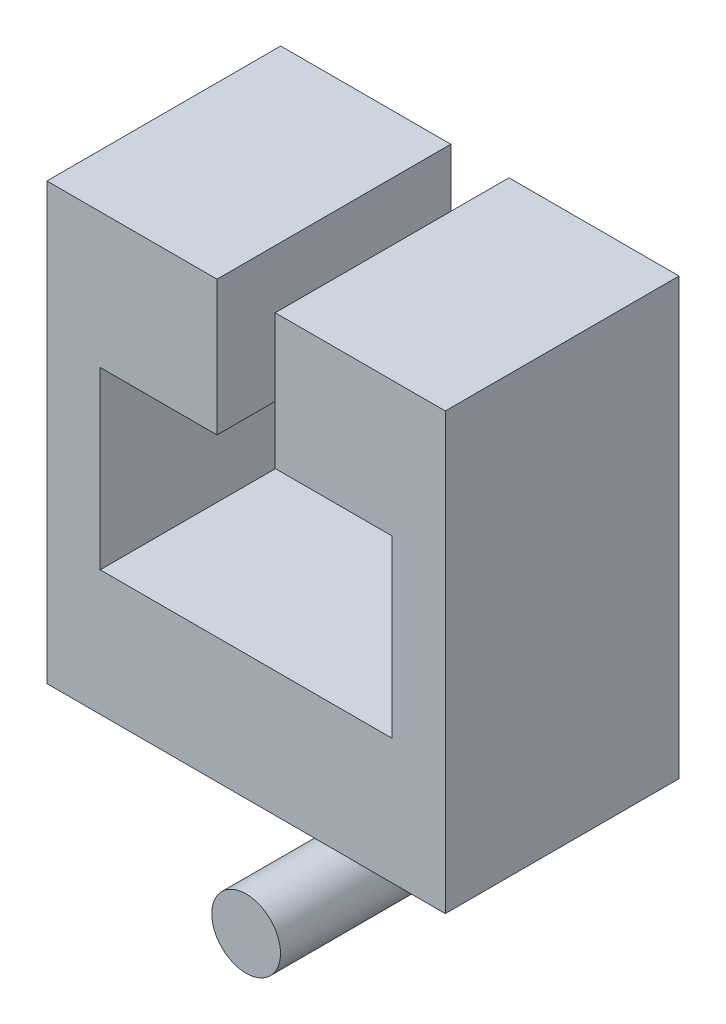
ISO-10303-21;
HEADER;
FILE_DESCRIPTION(('STEP AP214'),'2;1');
FILE_NAME('part.step','',(''),(''),'','','');
FILE_SCHEMA(('AUTOMOTIVE_DESIGN { 1 0 10303 214 1 1 1 1 }'));
ENDSEC;
DATA;
#1=APPLICATION_CONTEXT('core data for automotive mechanical design processes');
#2=APPLICATION_PROTOCOL_DEFINITION('international standard','automotive_design',2000,#1);
#3=PRODUCT_CONTEXT('',#1,'mechanical');
#4=PRODUCT('Part','Part','',(#3));
#5=PRODUCT_RELATED_PRODUCT_CATEGORY('part','',(#4));
#6=PRODUCT_DEFINITION_FORMATION('','',#4);
#7=PRODUCT_DEFINITION_CONTEXT('part definition',#1,'design');
#8=PRODUCT_DEFINITION('design','',#6,#7);
#9=PRODUCT_DEFINITION_SHAPE('','',#8);
#10=(LENGTH_UNIT() NAMED_UNIT(*) SI_UNIT(.MILLI.,.METRE.));
#11=(NAMED_UNIT(*) PLANE_ANGLE_UNIT() SI_UNIT($,.RADIAN.));
#12=(NAMED_UNIT(*) SI_UNIT($,.STERADIAN.) SOLID_ANGLE_UNIT());
#13=UNCERTAINTY_MEASURE_WITH_UNIT(LENGTH_MEASURE(1.E-05),#10,'distance_accuracy_value','');
#14=(GEOMETRIC_REPRESENTATION_CONTEXT(3) GLOBAL_UNCERTAINTY_ASSIGNED_CONTEXT((#13)) GLOBAL_UNIT_ASSIGNED_CONTEXT((#10,
#11,#12)) REPRESENTATION_CONTEXT('',''));
#15=CARTESIAN_POINT('',(0.,0.,0.));
#16=DIRECTION('',(0.,0.,1.));
#17=DIRECTION('',(1.,0.,0.));
#18=AXIS2_PLACEMENT_3D('',#15,#16,#17);
#19=CARTESIAN_POINT('',(0.,0.,-37.84854));
#20=DIRECTION('',(0.,0.,1.));
#21=DIRECTION('',(1.,0.,0.));
#22=AXIS2_PLACEMENT_3D('',#19,#20,#21);
#23=PLANE('',#22);
#24=CARTESIAN_POINT('',(0.,0.,-37.84854));
#25=DIRECTION('',(0.,0.,1.));
#26=DIRECTION('',(1.,0.,0.));
#27=AXIS2_PLACEMENT_3D('',#24,#25,#26);
#28=CIRCLE('',#27,7.47268);
#29=CARTESIAN_POINT('',(-4.93268,5.6133425336425,-37.84854));
#30=VERTEX_POINT('',#29);
#31=CARTESIAN_POINT('',(4.93268,5.6133425336425,-37.84854));
#32=VERTEX_POINT('',#31);
#33=EDGE_CURVE('E62',#30,#32,#28,.F.);
#34=ORIENTED_EDGE('',*,*,#33,.T.);
#35=DIRECTION('',(0.,1.,0.));
#36=VECTOR('',#35,1.);
#37=CARTESIAN_POINT('',(4.93268,25.4,-37.84854));
#38=LINE('',#37,#36);
#39=CARTESIAN_POINT('',(4.93268,25.4,-37.84854));
#40=VERTEX_POINT('',#39);
#41=EDGE_CURVE('E203',#32,#40,#38,.T.);
#42=ORIENTED_EDGE('',*,*,#41,.T.);
#43=DIRECTION('',(1.,0.,0.));
#44=VECTOR('',#43,1.);
#45=CARTESIAN_POINT('',(7.47268,25.4,-37.84854));
#46=LINE('',#45,#44);
#47=CARTESIAN_POINT('',(-4.93268,25.4,-37.84854));
#48=VERTEX_POINT('',#47);
#49=EDGE_CURVE('E193',#48,#40,#46,.T.);
#50=ORIENTED_EDGE('',*,*,#49,.F.);
#51=DIRECTION('',(0.,-1.,0.));
#52=VECTOR('',#51,1.);
#53=CARTESIAN_POINT('',(-4.93268,25.4,-37.84854));
#54=LINE('',#53,#52);
#55=EDGE_CURVE('E216',#48,#30,#54,.T.);
#56=ORIENTED_EDGE('',*,*,#55,.T.);
#57=EDGE_LOOP('',(#34,#42,#50,#56));
#58=FACE_BOUND('',#57,.T.);
#59=ADVANCED_FACE('F55',(#58),#23,.T.);
#60=CARTESIAN_POINT('',(31.70428,52.61864,0.));
#61=DIRECTION('',(-1.,0.,0.));
#62=DIRECTION('',(0.,0.,1.));
#63=AXIS2_PLACEMENT_3D('',#60,#61,#62);
#64=PLANE('',#63);
#65=DIRECTION('',(0.,1.,0.));
#66=VECTOR('',#65,1.);
#67=CARTESIAN_POINT('',(31.70428,52.61864,0.));
#68=LINE('',#67,#66);
#69=CARTESIAN_POINT('',(31.70428,52.61864,0.));
#70=VERTEX_POINT('',#69);
#71=CARTESIAN_POINT('',(31.70428,90.69324,0.));
#72=VERTEX_POINT('',#71);
#73=EDGE_CURVE('E289',#70,#72,#68,.T.);
#74=ORIENTED_EDGE('',*,*,#73,.T.);
#75=DIRECTION('',(0.,0.,-1.));
#76=VECTOR('',#75,1.);
#77=CARTESIAN_POINT('',(31.70428,90.69324,0.));
#78=LINE('',#77,#76);
#79=CARTESIAN_POINT('',(31.70428,90.69324,-50.8));
#80=VERTEX_POINT('',#79);
#81=EDGE_CURVE('E406',#72,#80,#78,.T.);
#82=ORIENTED_EDGE('',*,*,#81,.T.);
#83=DIRECTION('',(0.,1.,0.));
#84=VECTOR('',#83,1.);
#85=CARTESIAN_POINT('',(31.70428,52.61864,-50.8));
#86=LINE('',#85,#84);
#87=CARTESIAN_POINT('',(31.70428,52.61864,-50.8));
#88=VERTEX_POINT('',#87);
#89=EDGE_CURVE('E292',#88,#80,#86,.T.);
#90=ORIENTED_EDGE('',*,*,#89,.F.);
#91=DIRECTION('',(0.,0.,-1.));
#92=VECTOR('',#91,1.);
#93=CARTESIAN_POINT('',(31.70428,52.61864,0.));
#94=LINE('',#93,#92);
#95=EDGE_CURVE('E293',#70,#88,#94,.T.);
#96=ORIENTED_EDGE('',*,*,#95,.F.);
#97=EDGE_LOOP('',(#74,#82,#90,#96));
#98=FACE_BOUND('',#97,.T.);
#99=ADVANCED_FACE('F467',(#98),#64,.T.);
#100=CARTESIAN_POINT('',(31.70428,52.61864,0.));
#101=DIRECTION('',(0.,1.,0.));
#102=DIRECTION('',(0.,0.,1.));
#103=AXIS2_PLACEMENT_3D('',#100,#101,#102);
#104=PLANE('',#103);
#105=DIRECTION('',(0.,0.,-1.));
#106=VECTOR('',#105,1.);
#107=CARTESIAN_POINT('',(-31.70428,52.61864,0.));
#108=LINE('',#107,#106);
#109=CARTESIAN_POINT('',(-31.70428,52.61864,0.));
#110=VERTEX_POINT('',#109);
#111=CARTESIAN_POINT('',(-31.70428,52.61864,-50.8));
#112=VERTEX_POINT('',#111);
#113=EDGE_CURVE('E387',#110,#112,#108,.T.);
#114=ORIENTED_EDGE('',*,*,#113,.F.);
#115=DIRECTION('',(1.,0.,0.));
#116=VECTOR('',#115,1.);
#117=CARTESIAN_POINT('',(31.70428,52.61864,0.));
#118=LINE('',#117,#116);
#119=EDGE_CURVE('E314',#110,#70,#118,.T.);
#120=ORIENTED_EDGE('',*,*,#119,.T.);
#121=ORIENTED_EDGE('',*,*,#95,.T.);
#122=DIRECTION('',(1.,0.,0.));
#123=VECTOR('',#122,1.);
#124=CARTESIAN_POINT('',(31.70428,52.61864,-50.8));
#125=LINE('',#124,#123);
#126=EDGE_CURVE('E317',#112,#88,#125,.T.);
#127=ORIENTED_EDGE('',*,*,#126,.F.);
#128=EDGE_LOOP('',(#114,#120,#121,#127));
#129=FACE_BOUND('',#128,.T.);
#130=ADVANCED_FACE('F464',(#129),#104,.T.);
#131=CARTESIAN_POINT('',(0.,0.,-50.8));
#132=DIRECTION('',(0.,0.,1.));
#133=DIRECTION('',(1.,0.,0.));
#134=AXIS2_PLACEMENT_3D('',#131,#132,#133);
#135=CYLINDRICAL_SURFACE('',#134,7.47268);
#136=CARTESIAN_POINT('',(0.,0.,-37.84854));
#137=DIRECTION('',(0.,-0.707106781186548,0.707106781186547));
#138=DIRECTION('',(0.,0.707106781186547,0.707106781186548));
#139=AXIS2_PLACEMENT_3D('',#136,#137,#138);
#140=ELLIPSE('',#139,10.5679654032742,7.47268);
#141=CARTESIAN_POINT('',(4.93268,5.6133425336425,-32.2351974663575));
#142=VERTEX_POINT('',#141);
#143=CARTESIAN_POINT('',(7.47268,0.,-37.84854));
#144=VERTEX_POINT('',#143);
#145=EDGE_CURVE('E69',#142,#144,#140,.F.);
#146=ORIENTED_EDGE('',*,*,#145,.F.);
#147=DIRECTION('',(0.,0.,1.));
#148=VECTOR('',#147,1.);
#149=CARTESIAN_POINT('',(4.93268,5.6133425336425,-50.8));
#150=LINE('',#149,#148);
#151=EDGE_CURVE('E12',#142,#32,#150,.F.);
#152=ORIENTED_EDGE('',*,*,#151,.T.);
#153=ORIENTED_EDGE('',*,*,#33,.F.);
#154=DIRECTION('',(0.,0.,1.));
#155=VECTOR('',#154,1.);
#156=CARTESIAN_POINT('',(-4.93268,5.6133425336425,-50.8));
#157=LINE('',#156,#155);
#158=CARTESIAN_POINT('',(-4.93268,5.6133425336425,-32.2351974663575));
#159=VERTEX_POINT('',#158);
#160=EDGE_CURVE('E241',#159,#30,#157,.F.);
#161=ORIENTED_EDGE('',*,*,#160,.F.);
#162=CARTESIAN_POINT('',(0.,0.,-37.84854));
#163=DIRECTION('',(0.,-0.707106781186548,0.707106781186547));
#164=DIRECTION('',(0.,0.707106781186547,0.707106781186548));
#165=AXIS2_PLACEMENT_3D('',#162,#163,#164);
#166=ELLIPSE('',#165,10.5679654032742,7.47268);
#167=CARTESIAN_POINT('',(-7.47268,0.,-37.84854));
#168=VERTEX_POINT('',#167);
#169=EDGE_CURVE('E240',#168,#159,#166,.F.);
#170=ORIENTED_EDGE('',*,*,#169,.F.);
#171=DIRECTION('',(0.,0.,-1.));
#172=VECTOR('',#171,1.);
#173=CARTESIAN_POINT('',(-7.47268,0.,-37.84854));
#174=LINE('',#173,#172);
#175=CARTESIAN_POINT('',(-7.47268,0.,-50.8));
#176=VERTEX_POINT('',#175);
#177=EDGE_CURVE('E344',#168,#176,#174,.T.);
#178=ORIENTED_EDGE('',*,*,#177,.T.);
#179=CARTESIAN_POINT('',(0.,0.,-50.8));
#180=DIRECTION('',(0.,0.,1.));
#181=DIRECTION('',(1.,0.,0.));
#182=AXIS2_PLACEMENT_3D('',#179,#180,#181);
#183=CIRCLE('',#182,7.47268);
#184=CARTESIAN_POINT('',(7.47268,0.,-50.8));
#185=VERTEX_POINT('',#184);
#186=EDGE_CURVE('E350',#176,#185,#183,.T.);
#187=ORIENTED_EDGE('',*,*,#186,.T.);
#188=DIRECTION('',(0.,0.,-1.));
#189=VECTOR('',#188,1.);
#190=CARTESIAN_POINT('',(7.47268,0.,-37.84854));
#191=LINE('',#190,#189);
#192=EDGE_CURVE('E327',#144,#185,#191,.T.);
#193=ORIENTED_EDGE('',*,*,#192,.F.);
#194=EDGE_LOOP('',(#146,#152,#153,#161,#170,#178,#187,#193));
#195=FACE_BOUND('',#194,.T.);
#196=CARTESIAN_POINT('',(0.,0.,0.));
#197=DIRECTION('',(0.,0.,1.));
#198=DIRECTION('',(1.,0.,0.));
#199=AXIS2_PLACEMENT_3D('',#196,#197,#198);
#200=CIRCLE('',#199,7.47268);
#201=CARTESIAN_POINT('',(7.47268,0.,0.));
#202=VERTEX_POINT('',#201);
#203=EDGE_CURVE('E339',#202,#202,#200,.T.);
#204=ORIENTED_EDGE('',*,*,#203,.F.);
#205=EDGE_LOOP('',(#204));
#206=FACE_BOUND('',#205,.T.);
#207=ADVANCED_FACE('F53',(#195,#206),#135,.T.);
#208=CARTESIAN_POINT('',(0.,0.,-50.8));
#209=DIRECTION('',(0.,0.,1.));
#210=DIRECTION('',(1.,0.,0.));
#211=AXIS2_PLACEMENT_3D('',#208,#209,#210);
#212=PLANE('',#211);
#213=ORIENTED_EDGE('',*,*,#186,.F.);
#214=DIRECTION('',(0.,1.,0.));
#215=VECTOR('',#214,1.);
#216=CARTESIAN_POINT('',(-7.47268,0.,-50.8));
#217=LINE('',#216,#215);
#218=CARTESIAN_POINT('',(-7.47268,25.4,-50.8));
#219=VERTEX_POINT('',#218);
#220=EDGE_CURVE('E330',#176,#219,#217,.T.);
#221=ORIENTED_EDGE('',*,*,#220,.T.);
#222=DIRECTION('',(-1.,0.,0.));
#223=VECTOR('',#222,1.);
#224=CARTESIAN_POINT('',(31.70428,25.4,-50.8));
#225=LINE('',#224,#223);
#226=CARTESIAN_POINT('',(-43.28668,25.4,-50.8));
#227=VERTEX_POINT('',#226);
#228=EDGE_CURVE('E311',#219,#227,#225,.T.);
#229=ORIENTED_EDGE('',*,*,#228,.T.);
#230=DIRECTION('',(0.,1.,0.));
#231=VECTOR('',#230,1.);
#232=CARTESIAN_POINT('',(-43.28668,25.4,-50.8));
#233=LINE('',#232,#231);
#234=CARTESIAN_POINT('',(-43.28668,120.00738,-50.8));
#235=VERTEX_POINT('',#234);
#236=EDGE_CURVE('E282',#227,#235,#233,.T.);
#237=ORIENTED_EDGE('',*,*,#236,.T.);
#238=DIRECTION('',(1.,0.,0.));
#239=VECTOR('',#238,1.);
#240=CARTESIAN_POINT('',(-31.70428,120.00738,-50.8));
#241=LINE('',#240,#239);
#242=CARTESIAN_POINT('',(-6.3246,120.00738,-50.8));
#243=VERTEX_POINT('',#242);
#244=EDGE_CURVE('E426',#235,#243,#241,.T.);
#245=ORIENTED_EDGE('',*,*,#244,.T.);
#246=DIRECTION('',(0.,-1.,0.));
#247=VECTOR('',#246,1.);
#248=CARTESIAN_POINT('',(-6.3246,90.69324,-50.8));
#249=LINE('',#248,#247);
#250=CARTESIAN_POINT('',(-6.3246,90.69324,-50.8));
#251=VERTEX_POINT('',#250);
#252=EDGE_CURVE('E263',#243,#251,#249,.T.);
#253=ORIENTED_EDGE('',*,*,#252,.T.);
#254=DIRECTION('',(-1.,0.,0.));
#255=VECTOR('',#254,1.);
#256=CARTESIAN_POINT('',(-31.70428,90.69324,-50.8));
#257=LINE('',#256,#255);
#258=CARTESIAN_POINT('',(-31.70428,90.69324,-50.8));
#259=VERTEX_POINT('',#258);
#260=EDGE_CURVE('E260',#251,#259,#257,.T.);
#261=ORIENTED_EDGE('',*,*,#260,.T.);
#262=DIRECTION('',(0.,-1.,0.));
#263=VECTOR('',#262,1.);
#264=CARTESIAN_POINT('',(-31.70428,52.61864,-50.8));
#265=LINE('',#264,#263);
#266=EDGE_CURVE('E382',#259,#112,#265,.T.);
#267=ORIENTED_EDGE('',*,*,#266,.T.);
#268=ORIENTED_EDGE('',*,*,#126,.T.);
#269=ORIENTED_EDGE('',*,*,#89,.T.);
#270=DIRECTION('',(-1.,0.,0.));
#271=VECTOR('',#270,1.);
#272=CARTESIAN_POINT('',(31.70428,90.69324,-50.8));
#273=LINE('',#272,#271);
#274=CARTESIAN_POINT('',(6.3246,90.69324,-50.8));
#275=VERTEX_POINT('',#274);
#276=EDGE_CURVE('E425',#80,#275,#273,.T.);
#277=ORIENTED_EDGE('',*,*,#276,.T.);
#278=DIRECTION('',(0.,1.,0.));
#279=VECTOR('',#278,1.);
#280=CARTESIAN_POINT('',(6.3246,90.69324,-50.8));
#281=LINE('',#280,#279);
#282=CARTESIAN_POINT('',(6.3246,120.00738,-50.8));
#283=VERTEX_POINT('',#282);
#284=EDGE_CURVE('E416',#275,#283,#281,.T.);
#285=ORIENTED_EDGE('',*,*,#284,.T.);
#286=DIRECTION('',(1.,0.,0.));
#287=VECTOR('',#286,1.);
#288=CARTESIAN_POINT('',(31.70428,120.00738,-50.8));
#289=LINE('',#288,#287);
#290=CARTESIAN_POINT('',(43.28668,120.00738,-50.8));
#291=VERTEX_POINT('',#290);
#292=EDGE_CURVE('E397',#283,#291,#289,.T.);
#293=ORIENTED_EDGE('',*,*,#292,.T.);
#294=DIRECTION('',(0.,-1.,0.));
#295=VECTOR('',#294,1.);
#296=CARTESIAN_POINT('',(43.28668,25.4,-50.8));
#297=LINE('',#296,#295);
#298=CARTESIAN_POINT('',(43.28668,25.4,-50.8));
#299=VERTEX_POINT('',#298);
#300=EDGE_CURVE('E299',#291,#299,#297,.T.);
#301=ORIENTED_EDGE('',*,*,#300,.T.);
#302=CARTESIAN_POINT('',(7.47268,25.4,-50.8));
#303=VERTEX_POINT('',#302);
#304=EDGE_CURVE('E318',#299,#303,#225,.T.);
#305=ORIENTED_EDGE('',*,*,#304,.T.);
#306=DIRECTION('',(0.,-1.,0.));
#307=VECTOR('',#306,1.);
#308=CARTESIAN_POINT('',(7.47268,0.,-50.8));
#309=LINE('',#308,#307);
#310=EDGE_CURVE('E316',#303,#185,#309,.T.);
#311=ORIENTED_EDGE('',*,*,#310,.T.);
#312=EDGE_LOOP('',(#213,#221,#229,#237,#245,#253,#261,#267,#268,#269,#277,#285,#293,#301,#305,#311));
#313=FACE_BOUND('',#312,.T.);
#314=ADVANCED_FACE('F373',(#313),#212,.F.);
#315=CARTESIAN_POINT('',(0.,0.,0.));
#316=DIRECTION('',(0.,0.,1.));
#317=DIRECTION('',(1.,0.,0.));
#318=AXIS2_PLACEMENT_3D('',#315,#316,#317);
#319=PLANE('',#318);
#320=ORIENTED_EDGE('',*,*,#203,.T.);
#321=EDGE_LOOP('',(#320));
#322=FACE_BOUND('',#321,.T.);
#323=ADVANCED_FACE('F482',(#322),#319,.T.);
#324=CARTESIAN_POINT('',(7.47268,0.,-37.84854));
#325=DIRECTION('',(1.,0.,0.));
#326=DIRECTION('',(0.,1.,0.));
#327=AXIS2_PLACEMENT_3D('',#324,#325,#326);
#328=PLANE('',#327);
#329=ORIENTED_EDGE('',*,*,#310,.F.);
#330=DIRECTION('',(0.,0.,-1.));
#331=VECTOR('',#330,1.);
#332=CARTESIAN_POINT('',(7.47268,25.4,-37.84854));
#333=LINE('',#332,#331);
#334=CARTESIAN_POINT('',(7.47268,25.4,-12.44854));
#335=VERTEX_POINT('',#334);
#336=EDGE_CURVE('E337',#335,#303,#333,.T.);
#337=ORIENTED_EDGE('',*,*,#336,.F.);
#338=DIRECTION('',(0.,-0.707106781186547,-0.707106781186548));
#339=VECTOR('',#338,1.);
#340=CARTESIAN_POINT('',(7.47268,0.,-37.84854));
#341=LINE('',#340,#339);
#342=EDGE_CURVE('E210',#335,#144,#341,.T.);
#343=ORIENTED_EDGE('',*,*,#342,.T.);
#344=ORIENTED_EDGE('',*,*,#192,.T.);
#345=EDGE_LOOP('',(#329,#337,#343,#344));
#346=FACE_BOUND('',#345,.T.);
#347=ADVANCED_FACE('F483',(#346),#328,.T.);
#348=CARTESIAN_POINT('',(-7.47268,0.,-37.84854));
#349=DIRECTION('',(-1.,0.,0.));
#350=DIRECTION('',(0.,-1.,0.));
#351=AXIS2_PLACEMENT_3D('',#348,#349,#350);
#352=PLANE('',#351);
#353=ORIENTED_EDGE('',*,*,#220,.F.);
#354=ORIENTED_EDGE('',*,*,#177,.F.);
#355=DIRECTION('',(0.,0.707106781186547,0.707106781186548));
#356=VECTOR('',#355,1.);
#357=CARTESIAN_POINT('',(-7.47268,0.,-37.84854));
#358=LINE('',#357,#356);
#359=CARTESIAN_POINT('',(-7.47268,25.4,-12.44854));
#360=VERTEX_POINT('',#359);
#361=EDGE_CURVE('E220',#168,#360,#358,.T.);
#362=ORIENTED_EDGE('',*,*,#361,.T.);
#363=DIRECTION('',(0.,0.,-1.));
#364=VECTOR('',#363,1.);
#365=CARTESIAN_POINT('',(-7.47268,25.4,-37.84854));
#366=LINE('',#365,#364);
#367=EDGE_CURVE('E338',#360,#219,#366,.T.);
#368=ORIENTED_EDGE('',*,*,#367,.T.);
#369=EDGE_LOOP('',(#353,#354,#362,#368));
#370=FACE_BOUND('',#369,.T.);
#371=ADVANCED_FACE('F369',(#370),#352,.T.);
#372=CARTESIAN_POINT('',(31.70428,25.4,0.));
#373=DIRECTION('',(0.,-1.,0.));
#374=DIRECTION('',(0.,0.,-1.));
#375=AXIS2_PLACEMENT_3D('',#372,#373,#374);
#376=PLANE('',#375);
#377=DIRECTION('',(1.,0.,0.));
#378=VECTOR('',#377,1.);
#379=CARTESIAN_POINT('',(4.93268,25.4,-12.44854));
#380=LINE('',#379,#378);
#381=CARTESIAN_POINT('',(4.93268,25.4,-12.44854));
#382=VERTEX_POINT('',#381);
#383=EDGE_CURVE('E195',#382,#335,#380,.T.);
#384=ORIENTED_EDGE('',*,*,#383,.T.);
#385=ORIENTED_EDGE('',*,*,#336,.T.);
#386=ORIENTED_EDGE('',*,*,#304,.F.);
#387=DIRECTION('',(0.,0.,-1.));
#388=VECTOR('',#387,1.);
#389=CARTESIAN_POINT('',(43.28668,25.4,0.));
#390=LINE('',#389,#388);
#391=CARTESIAN_POINT('',(43.28668,25.4,0.));
#392=VERTEX_POINT('',#391);
#393=EDGE_CURVE('E302',#392,#299,#390,.T.);
#394=ORIENTED_EDGE('',*,*,#393,.F.);
#395=DIRECTION('',(-1.,0.,0.));
#396=VECTOR('',#395,1.);
#397=CARTESIAN_POINT('',(31.70428,25.4,0.));
#398=LINE('',#397,#396);
#399=CARTESIAN_POINT('',(-43.28668,25.4,0.));
#400=VERTEX_POINT('',#399);
#401=EDGE_CURVE('E315',#392,#400,#398,.T.);
#402=ORIENTED_EDGE('',*,*,#401,.T.);
#403=DIRECTION('',(0.,0.,-1.));
#404=VECTOR('',#403,1.);
#405=CARTESIAN_POINT('',(-43.28668,25.4,0.));
#406=LINE('',#405,#404);
#407=EDGE_CURVE('E285',#400,#227,#406,.T.);
#408=ORIENTED_EDGE('',*,*,#407,.T.);
#409=ORIENTED_EDGE('',*,*,#228,.F.);
#410=ORIENTED_EDGE('',*,*,#367,.F.);
#411=DIRECTION('',(-1.,0.,0.));
#412=VECTOR('',#411,1.);
#413=CARTESIAN_POINT('',(-4.93268,25.4,-12.44854));
#414=LINE('',#413,#412);
#415=CARTESIAN_POINT('',(-4.93268,25.4,-12.44854));
#416=VERTEX_POINT('',#415);
#417=EDGE_CURVE('E229',#416,#360,#414,.T.);
#418=ORIENTED_EDGE('',*,*,#417,.F.);
#419=DIRECTION('',(0.,0.,-1.));
#420=VECTOR('',#419,1.);
#421=CARTESIAN_POINT('',(-4.93268,25.4,-12.44854));
#422=LINE('',#421,#420);
#423=EDGE_CURVE('E227',#416,#48,#422,.T.);
#424=ORIENTED_EDGE('',*,*,#423,.T.);
#425=ORIENTED_EDGE('',*,*,#49,.T.);
#426=DIRECTION('',(0.,0.,1.));
#427=VECTOR('',#426,1.);
#428=CARTESIAN_POINT('',(4.93268,25.4,-12.44854));
#429=LINE('',#428,#427);
#430=EDGE_CURVE('E189',#40,#382,#429,.T.);
#431=ORIENTED_EDGE('',*,*,#430,.T.);
#432=EDGE_LOOP('',(#384,#385,#386,#394,#402,#408,#409,#410,#418,#424,#425,#431));
#433=FACE_BOUND('',#432,.T.);
#434=ADVANCED_FACE('F188',(#433),#376,.T.);
#435=CARTESIAN_POINT('',(0.,0.,0.));
#436=DIRECTION('',(0.,0.,1.));
#437=DIRECTION('',(1.,0.,0.));
#438=AXIS2_PLACEMENT_3D('',#435,#436,#437);
#439=PLANE('',#438);
#440=ORIENTED_EDGE('',*,*,#401,.F.);
#441=DIRECTION('',(0.,-1.,0.));
#442=VECTOR('',#441,1.);
#443=CARTESIAN_POINT('',(43.28668,25.4,0.));
#444=LINE('',#443,#442);
#445=CARTESIAN_POINT('',(43.28668,120.00738,0.));
#446=VERTEX_POINT('',#445);
#447=EDGE_CURVE('E297',#446,#392,#444,.T.);
#448=ORIENTED_EDGE('',*,*,#447,.F.);
#449=DIRECTION('',(1.,0.,0.));
#450=VECTOR('',#449,1.);
#451=CARTESIAN_POINT('',(31.70428,120.00738,0.));
#452=LINE('',#451,#450);
#453=CARTESIAN_POINT('',(6.3246,120.00738,0.));
#454=VERTEX_POINT('',#453);
#455=EDGE_CURVE('E395',#454,#446,#452,.T.);
#456=ORIENTED_EDGE('',*,*,#455,.F.);
#457=DIRECTION('',(0.,1.,0.));
#458=VECTOR('',#457,1.);
#459=CARTESIAN_POINT('',(6.3246,90.69324,0.));
#460=LINE('',#459,#458);
#461=CARTESIAN_POINT('',(6.3246,90.69324,0.));
#462=VERTEX_POINT('',#461);
#463=EDGE_CURVE('E412',#462,#454,#460,.T.);
#464=ORIENTED_EDGE('',*,*,#463,.F.);
#465=DIRECTION('',(-1.,0.,0.));
#466=VECTOR('',#465,1.);
#467=CARTESIAN_POINT('',(31.70428,90.69324,0.));
#468=LINE('',#467,#466);
#469=EDGE_CURVE('E419',#72,#462,#468,.T.);
#470=ORIENTED_EDGE('',*,*,#469,.F.);
#471=ORIENTED_EDGE('',*,*,#73,.F.);
#472=ORIENTED_EDGE('',*,*,#119,.F.);
#473=DIRECTION('',(0.,-1.,0.));
#474=VECTOR('',#473,1.);
#475=CARTESIAN_POINT('',(-31.70428,52.61864,0.));
#476=LINE('',#475,#474);
#477=CARTESIAN_POINT('',(-31.70428,90.69324,0.));
#478=VERTEX_POINT('',#477);
#479=EDGE_CURVE('E384',#478,#110,#476,.T.);
#480=ORIENTED_EDGE('',*,*,#479,.F.);
#481=DIRECTION('',(-1.,0.,0.));
#482=VECTOR('',#481,1.);
#483=CARTESIAN_POINT('',(-31.70428,90.69324,0.));
#484=LINE('',#483,#482);
#485=CARTESIAN_POINT('',(-6.3246,90.69324,0.));
#486=VERTEX_POINT('',#485);
#487=EDGE_CURVE('E249',#486,#478,#484,.T.);
#488=ORIENTED_EDGE('',*,*,#487,.F.);
#489=DIRECTION('',(0.,-1.,0.));
#490=VECTOR('',#489,1.);
#491=CARTESIAN_POINT('',(-6.3246,90.69324,0.));
#492=LINE('',#491,#490);
#493=CARTESIAN_POINT('',(-6.3246,120.00738,0.));
#494=VERTEX_POINT('',#493);
#495=EDGE_CURVE('E264',#494,#486,#492,.T.);
#496=ORIENTED_EDGE('',*,*,#495,.F.);
#497=DIRECTION('',(1.,0.,0.));
#498=VECTOR('',#497,1.);
#499=CARTESIAN_POINT('',(-31.70428,120.00738,0.));
#500=LINE('',#499,#498);
#501=CARTESIAN_POINT('',(-43.28668,120.00738,0.));
#502=VERTEX_POINT('',#501);
#503=EDGE_CURVE('E431',#502,#494,#500,.T.);
#504=ORIENTED_EDGE('',*,*,#503,.F.);
#505=DIRECTION('',(0.,1.,0.));
#506=VECTOR('',#505,1.);
#507=CARTESIAN_POINT('',(-43.28668,25.4,0.));
#508=LINE('',#507,#506);
#509=EDGE_CURVE('E276',#400,#502,#508,.T.);
#510=ORIENTED_EDGE('',*,*,#509,.F.);
#511=EDGE_LOOP('',(#440,#448,#456,#464,#470,#471,#472,#480,#488,#496,#504,#510));
#512=FACE_BOUND('',#511,.T.);
#513=ADVANCED_FACE('F458',(#512),#439,.T.);
#514=CARTESIAN_POINT('',(43.28668,25.4,0.));
#515=DIRECTION('',(1.,0.,0.));
#516=DIRECTION('',(0.,0.,-1.));
#517=AXIS2_PLACEMENT_3D('',#514,#515,#516);
#518=PLANE('',#517);
#519=ORIENTED_EDGE('',*,*,#300,.F.);
#520=DIRECTION('',(0.,0.,-1.));
#521=VECTOR('',#520,1.);
#522=CARTESIAN_POINT('',(43.28668,120.00738,0.));
#523=LINE('',#522,#521);
#524=EDGE_CURVE('E388',#446,#291,#523,.T.);
#525=ORIENTED_EDGE('',*,*,#524,.F.);
#526=ORIENTED_EDGE('',*,*,#447,.T.);
#527=ORIENTED_EDGE('',*,*,#393,.T.);
#528=EDGE_LOOP('',(#519,#525,#526,#527));
#529=FACE_BOUND('',#528,.T.);
#530=ADVANCED_FACE('F477',(#529),#518,.T.);
#531=CARTESIAN_POINT('',(-43.28668,25.4,0.));
#532=DIRECTION('',(-1.,0.,0.));
#533=DIRECTION('',(0.,0.,1.));
#534=AXIS2_PLACEMENT_3D('',#531,#532,#533);
#535=PLANE('',#534);
#536=ORIENTED_EDGE('',*,*,#236,.F.);
#537=ORIENTED_EDGE('',*,*,#407,.F.);
#538=ORIENTED_EDGE('',*,*,#509,.T.);
#539=DIRECTION('',(0.,0.,-1.));
#540=VECTOR('',#539,1.);
#541=CARTESIAN_POINT('',(-43.28668,120.00738,0.));
#542=LINE('',#541,#540);
#543=EDGE_CURVE('E268',#502,#235,#542,.T.);
#544=ORIENTED_EDGE('',*,*,#543,.T.);
#545=EDGE_LOOP('',(#536,#537,#538,#544));
#546=FACE_BOUND('',#545,.T.);
#547=ADVANCED_FACE('F438',(#546),#535,.T.);
#548=CARTESIAN_POINT('',(-31.70428,52.61864,0.));
#549=DIRECTION('',(1.,0.,0.));
#550=DIRECTION('',(0.,0.,-1.));
#551=AXIS2_PLACEMENT_3D('',#548,#549,#550);
#552=PLANE('',#551);
#553=DIRECTION('',(0.,0.,-1.));
#554=VECTOR('',#553,1.);
#555=CARTESIAN_POINT('',(-31.70428,90.69324,0.));
#556=LINE('',#555,#554);
#557=EDGE_CURVE('E244',#478,#259,#556,.T.);
#558=ORIENTED_EDGE('',*,*,#557,.F.);
#559=ORIENTED_EDGE('',*,*,#479,.T.);
#560=ORIENTED_EDGE('',*,*,#113,.T.);
#561=ORIENTED_EDGE('',*,*,#266,.F.);
#562=EDGE_LOOP('',(#558,#559,#560,#561));
#563=FACE_BOUND('',#562,.T.);
#564=ADVANCED_FACE('F455',(#563),#552,.T.);
#565=CARTESIAN_POINT('',(31.70428,120.00738,0.));
#566=DIRECTION('',(0.,1.,0.));
#567=DIRECTION('',(0.,0.,1.));
#568=AXIS2_PLACEMENT_3D('',#565,#566,#567);
#569=PLANE('',#568);
#570=ORIENTED_EDGE('',*,*,#292,.F.);
#571=DIRECTION('',(0.,0.,-1.));
#572=VECTOR('',#571,1.);
#573=CARTESIAN_POINT('',(6.3246,120.00738,0.));
#574=LINE('',#573,#572);
#575=EDGE_CURVE('E405',#454,#283,#574,.T.);
#576=ORIENTED_EDGE('',*,*,#575,.F.);
#577=ORIENTED_EDGE('',*,*,#455,.T.);
#578=ORIENTED_EDGE('',*,*,#524,.T.);
#579=EDGE_LOOP('',(#570,#576,#577,#578));
#580=FACE_BOUND('',#579,.T.);
#581=ADVANCED_FACE('F473',(#580),#569,.T.);
#582=CARTESIAN_POINT('',(6.3246,90.69324,0.));
#583=DIRECTION('',(-1.,0.,0.));
#584=DIRECTION('',(0.,0.,1.));
#585=AXIS2_PLACEMENT_3D('',#582,#583,#584);
#586=PLANE('',#585);
#587=ORIENTED_EDGE('',*,*,#284,.F.);
#588=DIRECTION('',(0.,0.,-1.));
#589=VECTOR('',#588,1.);
#590=CARTESIAN_POINT('',(6.3246,90.69324,0.));
#591=LINE('',#590,#589);
#592=EDGE_CURVE('E407',#462,#275,#591,.T.);
#593=ORIENTED_EDGE('',*,*,#592,.F.);
#594=ORIENTED_EDGE('',*,*,#463,.T.);
#595=ORIENTED_EDGE('',*,*,#575,.T.);
#596=EDGE_LOOP('',(#587,#593,#594,#595));
#597=FACE_BOUND('',#596,.T.);
#598=ADVANCED_FACE('F475',(#597),#586,.T.);
#599=CARTESIAN_POINT('',(31.70428,90.69324,0.));
#600=DIRECTION('',(0.,-1.,0.));
#601=DIRECTION('',(0.,0.,-1.));
#602=AXIS2_PLACEMENT_3D('',#599,#600,#601);
#603=PLANE('',#602);
#604=ORIENTED_EDGE('',*,*,#276,.F.);
#605=ORIENTED_EDGE('',*,*,#81,.F.);
#606=ORIENTED_EDGE('',*,*,#469,.T.);
#607=ORIENTED_EDGE('',*,*,#592,.T.);
#608=EDGE_LOOP('',(#604,#605,#606,#607));
#609=FACE_BOUND('',#608,.T.);
#610=ADVANCED_FACE('F469',(#609),#603,.T.);
#611=CARTESIAN_POINT('',(-31.70428,120.00738,0.));
#612=DIRECTION('',(0.,1.,0.));
#613=DIRECTION('',(0.,0.,1.));
#614=AXIS2_PLACEMENT_3D('',#611,#612,#613);
#615=PLANE('',#614);
#616=ORIENTED_EDGE('',*,*,#244,.F.);
#617=ORIENTED_EDGE('',*,*,#543,.F.);
#618=ORIENTED_EDGE('',*,*,#503,.T.);
#619=DIRECTION('',(0.,0.,-1.));
#620=VECTOR('',#619,1.);
#621=CARTESIAN_POINT('',(-6.3246,120.00738,0.));
#622=LINE('',#621,#620);
#623=EDGE_CURVE('E246',#494,#243,#622,.T.);
#624=ORIENTED_EDGE('',*,*,#623,.T.);
#625=EDGE_LOOP('',(#616,#617,#618,#624));
#626=FACE_BOUND('',#625,.T.);
#627=ADVANCED_FACE('F445',(#626),#615,.T.);
#628=CARTESIAN_POINT('',(-31.70428,90.69324,0.));
#629=DIRECTION('',(0.,-1.,0.));
#630=DIRECTION('',(0.,0.,-1.));
#631=AXIS2_PLACEMENT_3D('',#628,#629,#630);
#632=PLANE('',#631);
#633=ORIENTED_EDGE('',*,*,#260,.F.);
#634=DIRECTION('',(0.,0.,-1.));
#635=VECTOR('',#634,1.);
#636=CARTESIAN_POINT('',(-6.3246,90.69324,0.));
#637=LINE('',#636,#635);
#638=EDGE_CURVE('E252',#486,#251,#637,.T.);
#639=ORIENTED_EDGE('',*,*,#638,.F.);
#640=ORIENTED_EDGE('',*,*,#487,.T.);
#641=ORIENTED_EDGE('',*,*,#557,.T.);
#642=EDGE_LOOP('',(#633,#639,#640,#641));
#643=FACE_BOUND('',#642,.T.);
#644=ADVANCED_FACE('F449',(#643),#632,.T.);
#645=CARTESIAN_POINT('',(-6.3246,90.69324,0.));
#646=DIRECTION('',(1.,0.,0.));
#647=DIRECTION('',(0.,0.,-1.));
#648=AXIS2_PLACEMENT_3D('',#645,#646,#647);
#649=PLANE('',#648);
#650=ORIENTED_EDGE('',*,*,#252,.F.);
#651=ORIENTED_EDGE('',*,*,#623,.F.);
#652=ORIENTED_EDGE('',*,*,#495,.T.);
#653=ORIENTED_EDGE('',*,*,#638,.T.);
#654=EDGE_LOOP('',(#650,#651,#652,#653));
#655=FACE_BOUND('',#654,.T.);
#656=ADVANCED_FACE('F522',(#655),#649,.T.);
#657=CARTESIAN_POINT('',(-4.93268,0.,-37.84854));
#658=DIRECTION('',(0.,-0.707106781186548,0.707106781186547));
#659=DIRECTION('',(0.,-0.707106781186547,-0.707106781186548));
#660=AXIS2_PLACEMENT_3D('',#657,#658,#659);
#661=PLANE('',#660);
#662=ORIENTED_EDGE('',*,*,#361,.F.);
#663=ORIENTED_EDGE('',*,*,#169,.T.);
#664=DIRECTION('',(0.,0.707106781186547,0.707106781186548));
#665=VECTOR('',#664,1.);
#666=CARTESIAN_POINT('',(-4.93268,0.,-37.84854));
#667=LINE('',#666,#665);
#668=EDGE_CURVE('E222',#159,#416,#667,.T.);
#669=ORIENTED_EDGE('',*,*,#668,.T.);
#670=ORIENTED_EDGE('',*,*,#417,.T.);
#671=EDGE_LOOP('',(#662,#663,#669,#670));
#672=FACE_BOUND('',#671,.T.);
#673=ADVANCED_FACE('F362',(#672),#661,.T.);
#674=CARTESIAN_POINT('',(-4.93268,0.,0.));
#675=DIRECTION('',(1.,0.,0.));
#676=DIRECTION('',(0.,1.,0.));
#677=AXIS2_PLACEMENT_3D('',#674,#675,#676);
#678=PLANE('',#677);
#679=ORIENTED_EDGE('',*,*,#668,.F.);
#680=ORIENTED_EDGE('',*,*,#160,.T.);
#681=ORIENTED_EDGE('',*,*,#55,.F.);
#682=ORIENTED_EDGE('',*,*,#423,.F.);
#683=EDGE_LOOP('',(#679,#680,#681,#682));
#684=FACE_BOUND('',#683,.T.);
#685=ADVANCED_FACE('F363',(#684),#678,.T.);
#686=CARTESIAN_POINT('',(4.93268,0.,-37.84854));
#687=DIRECTION('',(0.,-0.707106781186548,0.707106781186547));
#688=DIRECTION('',(0.,-0.707106781186547,-0.707106781186548));
#689=AXIS2_PLACEMENT_3D('',#686,#687,#688);
#690=PLANE('',#689);
#691=DIRECTION('',(0.,-0.707106781186547,-0.707106781186548));
#692=VECTOR('',#691,1.);
#693=CARTESIAN_POINT('',(4.93268,0.,-37.84854));
#694=LINE('',#693,#692);
#695=EDGE_CURVE('E196',#382,#142,#694,.T.);
#696=ORIENTED_EDGE('',*,*,#695,.T.);
#697=ORIENTED_EDGE('',*,*,#145,.T.);
#698=ORIENTED_EDGE('',*,*,#342,.F.);
#699=ORIENTED_EDGE('',*,*,#383,.F.);
#700=EDGE_LOOP('',(#696,#697,#698,#699));
#701=FACE_BOUND('',#700,.T.);
#702=ADVANCED_FACE('F201',(#701),#690,.T.);
#703=CARTESIAN_POINT('',(4.93268,0.,0.));
#704=DIRECTION('',(1.,0.,0.));
#705=DIRECTION('',(0.,1.,0.));
#706=AXIS2_PLACEMENT_3D('',#703,#704,#705);
#707=PLANE('',#706);
#708=ORIENTED_EDGE('',*,*,#151,.F.);
#709=ORIENTED_EDGE('',*,*,#695,.F.);
#710=ORIENTED_EDGE('',*,*,#430,.F.);
#711=ORIENTED_EDGE('',*,*,#41,.F.);
#712=EDGE_LOOP('',(#708,#709,#710,#711));
#713=FACE_BOUND('',#712,.T.);
#714=ADVANCED_FACE('F208',(#713),#707,.F.);
#715=CLOSED_SHELL('',(#59,#99,#130,#207,#314,#323,#347,#371,#434,#513,#530,#547,#564,#581,#598,
#610,#627,#644,#656,#673,#685,#702,#714));
#716=MANIFOLD_SOLID_BREP('B2',#715);
#717=ADVANCED_BREP_SHAPE_REPRESENTATION('',(#18,#716),#14);
#718=SHAPE_DEFINITION_REPRESENTATION(#9,#717);
ENDSEC;
END-ISO-10303-21;
